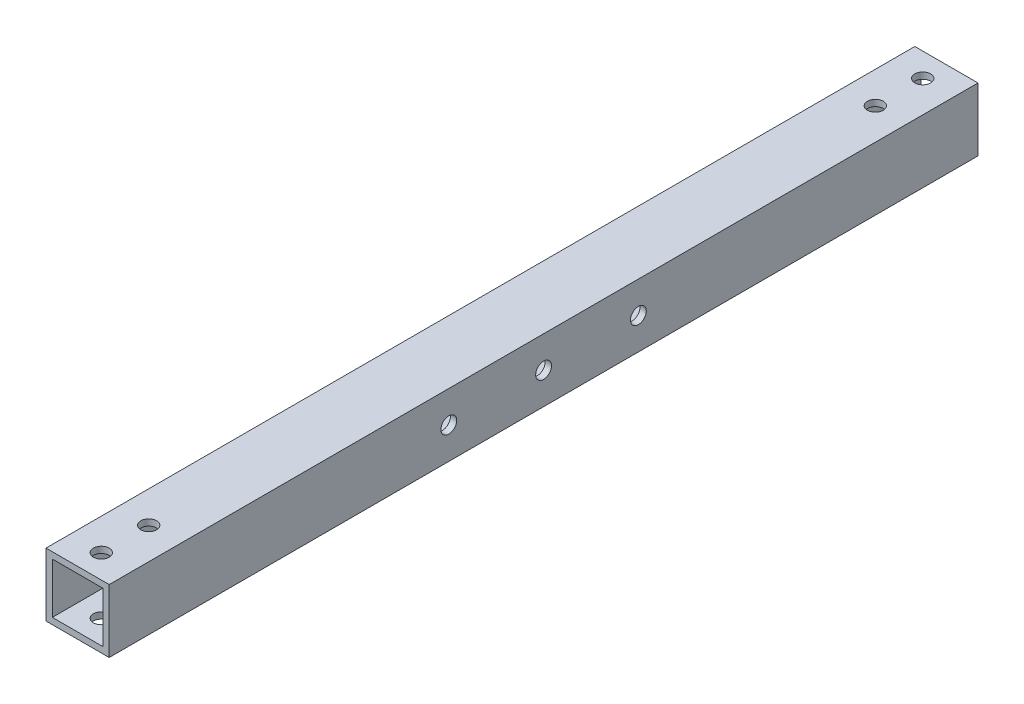
ISO-10303-21;
HEADER;
FILE_DESCRIPTION(('STEP AP214'),'2;1');
FILE_NAME('part.step','',(''),(''),'','','');
FILE_SCHEMA(('AUTOMOTIVE_DESIGN { 1 0 10303 214 1 1 1 1 }'));
ENDSEC;
DATA;
#1=APPLICATION_CONTEXT('core data for automotive mechanical design processes');
#2=APPLICATION_PROTOCOL_DEFINITION('international standard','automotive_design',2000,#1);
#3=PRODUCT_CONTEXT('',#1,'mechanical');
#4=PRODUCT('Part','Part','',(#3));
#5=PRODUCT_RELATED_PRODUCT_CATEGORY('part','',(#4));
#6=PRODUCT_DEFINITION_FORMATION('','',#4);
#7=PRODUCT_DEFINITION_CONTEXT('part definition',#1,'design');
#8=PRODUCT_DEFINITION('design','',#6,#7);
#9=PRODUCT_DEFINITION_SHAPE('','',#8);
#10=(LENGTH_UNIT() NAMED_UNIT(*) SI_UNIT(.MILLI.,.METRE.));
#11=(NAMED_UNIT(*) PLANE_ANGLE_UNIT() SI_UNIT($,.RADIAN.));
#12=(NAMED_UNIT(*) SI_UNIT($,.STERADIAN.) SOLID_ANGLE_UNIT());
#13=UNCERTAINTY_MEASURE_WITH_UNIT(LENGTH_MEASURE(1.E-05),#10,'distance_accuracy_value','');
#14=(GEOMETRIC_REPRESENTATION_CONTEXT(3) GLOBAL_UNCERTAINTY_ASSIGNED_CONTEXT((#13)) GLOBAL_UNIT_ASSIGNED_CONTEXT((#10,
#11,#12)) REPRESENTATION_CONTEXT('',''));
#15=CARTESIAN_POINT('',(0.,0.,0.));
#16=DIRECTION('',(0.,0.,1.));
#17=DIRECTION('',(1.,0.,0.));
#18=AXIS2_PLACEMENT_3D('',#15,#16,#17);
#19=CARTESIAN_POINT('',(0.,0.,275.));
#20=DIRECTION('',(0.,0.,1.));
#21=DIRECTION('',(1.,0.,0.));
#22=AXIS2_PLACEMENT_3D('',#19,#20,#21);
#23=PLANE('',#22);
#24=DIRECTION('',(0.,1.,0.));
#25=VECTOR('',#24,1.);
#26=CARTESIAN_POINT('',(10.,10.,275.));
#27=LINE('',#26,#25);
#28=CARTESIAN_POINT('',(10.,-10.,275.));
#29=VERTEX_POINT('',#28);
#30=CARTESIAN_POINT('',(10.,10.,275.));
#31=VERTEX_POINT('',#30);
#32=EDGE_CURVE('E138',#29,#31,#27,.T.);
#33=ORIENTED_EDGE('',*,*,#32,.T.);
#34=DIRECTION('',(-1.,0.,0.));
#35=VECTOR('',#34,1.);
#36=CARTESIAN_POINT('',(-10.,10.,275.));
#37=LINE('',#36,#35);
#38=CARTESIAN_POINT('',(-10.,10.,275.));
#39=VERTEX_POINT('',#38);
#40=EDGE_CURVE('E141',#31,#39,#37,.T.);
#41=ORIENTED_EDGE('',*,*,#40,.T.);
#42=DIRECTION('',(0.,-1.,0.));
#43=VECTOR('',#42,1.);
#44=CARTESIAN_POINT('',(-10.,10.,275.));
#45=LINE('',#44,#43);
#46=CARTESIAN_POINT('',(-9.99999999999999,-10.,275.));
#47=VERTEX_POINT('',#46);
#48=EDGE_CURVE('E144',#39,#47,#45,.T.);
#49=ORIENTED_EDGE('',*,*,#48,.T.);
#50=DIRECTION('',(1.,0.,0.));
#51=VECTOR('',#50,1.);
#52=CARTESIAN_POINT('',(-9.99999999999999,-10.,275.));
#53=LINE('',#52,#51);
#54=EDGE_CURVE('E146',#47,#29,#53,.T.);
#55=ORIENTED_EDGE('',*,*,#54,.T.);
#56=EDGE_LOOP('',(#33,#41,#49,#55));
#57=FACE_BOUND('',#56,.T.);
#58=DIRECTION('',(-1.,0.,0.));
#59=VECTOR('',#58,1.);
#60=CARTESIAN_POINT('',(-8.00000000000001,8.,275.));
#61=LINE('',#60,#59);
#62=CARTESIAN_POINT('',(8.,8.,275.));
#63=VERTEX_POINT('',#62);
#64=CARTESIAN_POINT('',(-8.00000000000001,8.,275.));
#65=VERTEX_POINT('',#64);
#66=EDGE_CURVE('E108',#63,#65,#61,.T.);
#67=ORIENTED_EDGE('',*,*,#66,.F.);
#68=DIRECTION('',(0.,1.,0.));
#69=VECTOR('',#68,1.);
#70=CARTESIAN_POINT('',(8.,8.,275.));
#71=LINE('',#70,#69);
#72=CARTESIAN_POINT('',(8.00000000000001,-8.,275.));
#73=VERTEX_POINT('',#72);
#74=EDGE_CURVE('E100',#73,#63,#71,.T.);
#75=ORIENTED_EDGE('',*,*,#74,.F.);
#76=DIRECTION('',(1.,0.,0.));
#77=VECTOR('',#76,1.);
#78=CARTESIAN_POINT('',(-8.,-8.00000000000001,275.));
#79=LINE('',#78,#77);
#80=CARTESIAN_POINT('',(-8.,-8.00000000000001,275.));
#81=VERTEX_POINT('',#80);
#82=EDGE_CURVE('E122',#81,#73,#79,.T.);
#83=ORIENTED_EDGE('',*,*,#82,.F.);
#84=DIRECTION('',(0.,-1.,0.));
#85=VECTOR('',#84,1.);
#86=CARTESIAN_POINT('',(-8.00000000000001,8.,275.));
#87=LINE('',#86,#85);
#88=EDGE_CURVE('E120',#65,#81,#87,.T.);
#89=ORIENTED_EDGE('',*,*,#88,.F.);
#90=EDGE_LOOP('',(#67,#75,#83,#89));
#91=FACE_BOUND('',#90,.T.);
#92=ADVANCED_FACE('F33',(#57,#91),#23,.T.);
#93=CARTESIAN_POINT('',(0.,0.,0.));
#94=DIRECTION('',(0.,0.,1.));
#95=DIRECTION('',(1.,0.,0.));
#96=AXIS2_PLACEMENT_3D('',#93,#94,#95);
#97=PLANE('',#96);
#98=DIRECTION('',(0.,1.,0.));
#99=VECTOR('',#98,1.);
#100=CARTESIAN_POINT('',(10.,10.,0.));
#101=LINE('',#100,#99);
#102=CARTESIAN_POINT('',(10.,-10.,0.));
#103=VERTEX_POINT('',#102);
#104=CARTESIAN_POINT('',(10.,10.,0.));
#105=VERTEX_POINT('',#104);
#106=EDGE_CURVE('E116',#103,#105,#101,.T.);
#107=ORIENTED_EDGE('',*,*,#106,.F.);
#108=DIRECTION('',(1.,0.,0.));
#109=VECTOR('',#108,1.);
#110=CARTESIAN_POINT('',(-9.99999999999999,-10.,0.));
#111=LINE('',#110,#109);
#112=CARTESIAN_POINT('',(-9.99999999999999,-10.,0.));
#113=VERTEX_POINT('',#112);
#114=EDGE_CURVE('E142',#113,#103,#111,.T.);
#115=ORIENTED_EDGE('',*,*,#114,.F.);
#116=DIRECTION('',(0.,-1.,0.));
#117=VECTOR('',#116,1.);
#118=CARTESIAN_POINT('',(-10.,10.,0.));
#119=LINE('',#118,#117);
#120=CARTESIAN_POINT('',(-10.,10.,0.));
#121=VERTEX_POINT('',#120);
#122=EDGE_CURVE('E153',#121,#113,#119,.T.);
#123=ORIENTED_EDGE('',*,*,#122,.F.);
#124=DIRECTION('',(-1.,0.,0.));
#125=VECTOR('',#124,1.);
#126=CARTESIAN_POINT('',(-10.,10.,0.));
#127=LINE('',#126,#125);
#128=EDGE_CURVE('E151',#105,#121,#127,.T.);
#129=ORIENTED_EDGE('',*,*,#128,.F.);
#130=EDGE_LOOP('',(#107,#115,#123,#129));
#131=FACE_BOUND('',#130,.T.);
#132=DIRECTION('',(0.,1.,0.));
#133=VECTOR('',#132,1.);
#134=CARTESIAN_POINT('',(8.,8.,0.));
#135=LINE('',#134,#133);
#136=CARTESIAN_POINT('',(8.00000000000001,-8.,0.));
#137=VERTEX_POINT('',#136);
#138=CARTESIAN_POINT('',(8.,8.,0.));
#139=VERTEX_POINT('',#138);
#140=EDGE_CURVE('E58',#137,#139,#135,.T.);
#141=ORIENTED_EDGE('',*,*,#140,.T.);
#142=DIRECTION('',(-1.,0.,0.));
#143=VECTOR('',#142,1.);
#144=CARTESIAN_POINT('',(-8.00000000000001,8.,0.));
#145=LINE('',#144,#143);
#146=CARTESIAN_POINT('',(-8.00000000000001,8.,0.));
#147=VERTEX_POINT('',#146);
#148=EDGE_CURVE('E115',#139,#147,#145,.T.);
#149=ORIENTED_EDGE('',*,*,#148,.T.);
#150=DIRECTION('',(0.,-1.,0.));
#151=VECTOR('',#150,1.);
#152=CARTESIAN_POINT('',(-8.00000000000001,8.,0.));
#153=LINE('',#152,#151);
#154=CARTESIAN_POINT('',(-8.,-8.00000000000001,0.));
#155=VERTEX_POINT('',#154);
#156=EDGE_CURVE('E130',#147,#155,#153,.T.);
#157=ORIENTED_EDGE('',*,*,#156,.T.);
#158=DIRECTION('',(1.,0.,0.));
#159=VECTOR('',#158,1.);
#160=CARTESIAN_POINT('',(-8.,-8.00000000000001,0.));
#161=LINE('',#160,#159);
#162=EDGE_CURVE('E109',#155,#137,#161,.T.);
#163=ORIENTED_EDGE('',*,*,#162,.T.);
#164=EDGE_LOOP('',(#141,#149,#157,#163));
#165=FACE_BOUND('',#164,.T.);
#166=ADVANCED_FACE('F266',(#131,#165),#97,.F.);
#167=CARTESIAN_POINT('',(10.,10.,275.));
#168=DIRECTION('',(-1.,0.,0.));
#169=DIRECTION('',(0.,0.,1.));
#170=AXIS2_PLACEMENT_3D('',#167,#168,#169);
#171=PLANE('',#170);
#172=CARTESIAN_POINT('',(10.,0.,167.5));
#173=DIRECTION('',(-1.,0.,0.));
#174=DIRECTION('',(0.,1.,0.));
#175=AXIS2_PLACEMENT_3D('',#172,#173,#174);
#176=CIRCLE('',#175,2.5);
#177=CARTESIAN_POINT('',(10.,2.5,167.5));
#178=VERTEX_POINT('',#177);
#179=EDGE_CURVE('E187',#178,#178,#176,.T.);
#180=ORIENTED_EDGE('',*,*,#179,.T.);
#181=EDGE_LOOP('',(#180));
#182=FACE_BOUND('',#181,.T.);
#183=CARTESIAN_POINT('',(10.,0.,137.5));
#184=DIRECTION('',(-1.,0.,0.));
#185=DIRECTION('',(0.,-1.,0.));
#186=AXIS2_PLACEMENT_3D('',#183,#184,#185);
#187=CIRCLE('',#186,2.5);
#188=CARTESIAN_POINT('',(10.,-2.5,137.5));
#189=VERTEX_POINT('',#188);
#190=EDGE_CURVE('E198',#189,#189,#187,.T.);
#191=ORIENTED_EDGE('',*,*,#190,.T.);
#192=EDGE_LOOP('',(#191));
#193=FACE_BOUND('',#192,.T.);
#194=CARTESIAN_POINT('',(10.,0.,107.5));
#195=DIRECTION('',(-1.,0.,0.));
#196=DIRECTION('',(0.,-1.,0.));
#197=AXIS2_PLACEMENT_3D('',#194,#195,#196);
#198=CIRCLE('',#197,2.5);
#199=CARTESIAN_POINT('',(10.,-2.5,107.5));
#200=VERTEX_POINT('',#199);
#201=EDGE_CURVE('E183',#200,#200,#198,.T.);
#202=ORIENTED_EDGE('',*,*,#201,.T.);
#203=EDGE_LOOP('',(#202));
#204=FACE_BOUND('',#203,.T.);
#205=ORIENTED_EDGE('',*,*,#106,.T.);
#206=DIRECTION('',(0.,0.,-1.));
#207=VECTOR('',#206,1.);
#208=CARTESIAN_POINT('',(10.,10.,275.));
#209=LINE('',#208,#207);
#210=EDGE_CURVE('E11',#31,#105,#209,.T.);
#211=ORIENTED_EDGE('',*,*,#210,.F.);
#212=ORIENTED_EDGE('',*,*,#32,.F.);
#213=DIRECTION('',(0.,0.,-1.));
#214=VECTOR('',#213,1.);
#215=CARTESIAN_POINT('',(10.,-10.,275.));
#216=LINE('',#215,#214);
#217=EDGE_CURVE('E148',#29,#103,#216,.T.);
#218=ORIENTED_EDGE('',*,*,#217,.T.);
#219=EDGE_LOOP('',(#205,#211,#212,#218));
#220=FACE_BOUND('',#219,.T.);
#221=ADVANCED_FACE('F35',(#182,#193,#204,#220),#171,.F.);
#222=CARTESIAN_POINT('',(-10.,10.,275.));
#223=DIRECTION('',(0.,-1.,0.));
#224=DIRECTION('',(0.,0.,-1.));
#225=AXIS2_PLACEMENT_3D('',#222,#223,#224);
#226=PLANE('',#225);
#227=CARTESIAN_POINT('',(0.,10.,267.5));
#228=DIRECTION('',(0.,-1.,0.));
#229=DIRECTION('',(0.,0.,1.));
#230=AXIS2_PLACEMENT_3D('',#227,#228,#229);
#231=CIRCLE('',#230,2.5);
#232=CARTESIAN_POINT('',(0.,10.,270.));
#233=VERTEX_POINT('',#232);
#234=EDGE_CURVE('E171',#233,#233,#231,.T.);
#235=ORIENTED_EDGE('',*,*,#234,.T.);
#236=EDGE_LOOP('',(#235));
#237=FACE_BOUND('',#236,.T.);
#238=CARTESIAN_POINT('',(0.,10.,252.5));
#239=DIRECTION('',(0.,-1.,0.));
#240=DIRECTION('',(0.,0.,-1.));
#241=AXIS2_PLACEMENT_3D('',#238,#239,#240);
#242=CIRCLE('',#241,2.5);
#243=CARTESIAN_POINT('',(0.,10.,250.));
#244=VERTEX_POINT('',#243);
#245=EDGE_CURVE('E222',#244,#244,#242,.T.);
#246=ORIENTED_EDGE('',*,*,#245,.T.);
#247=EDGE_LOOP('',(#246));
#248=FACE_BOUND('',#247,.T.);
#249=CARTESIAN_POINT('',(0.,10.,22.5));
#250=DIRECTION('',(0.,-1.,0.));
#251=DIRECTION('',(0.,0.,1.));
#252=AXIS2_PLACEMENT_3D('',#249,#250,#251);
#253=CIRCLE('',#252,2.5);
#254=CARTESIAN_POINT('',(0.,10.,25.));
#255=VERTEX_POINT('',#254);
#256=EDGE_CURVE('E228',#255,#255,#253,.T.);
#257=ORIENTED_EDGE('',*,*,#256,.T.);
#258=EDGE_LOOP('',(#257));
#259=FACE_BOUND('',#258,.T.);
#260=CARTESIAN_POINT('',(0.,10.,7.5));
#261=DIRECTION('',(0.,-1.,0.));
#262=DIRECTION('',(0.,0.,-1.));
#263=AXIS2_PLACEMENT_3D('',#260,#261,#262);
#264=CIRCLE('',#263,2.5);
#265=CARTESIAN_POINT('',(0.,10.,5.));
#266=VERTEX_POINT('',#265);
#267=EDGE_CURVE('E166',#266,#266,#264,.T.);
#268=ORIENTED_EDGE('',*,*,#267,.T.);
#269=EDGE_LOOP('',(#268));
#270=FACE_BOUND('',#269,.T.);
#271=ORIENTED_EDGE('',*,*,#128,.T.);
#272=DIRECTION('',(0.,0.,-1.));
#273=VECTOR('',#272,1.);
#274=CARTESIAN_POINT('',(-10.,10.,275.));
#275=LINE('',#274,#273);
#276=EDGE_CURVE('E42',#39,#121,#275,.T.);
#277=ORIENTED_EDGE('',*,*,#276,.F.);
#278=ORIENTED_EDGE('',*,*,#40,.F.);
#279=ORIENTED_EDGE('',*,*,#210,.T.);
#280=EDGE_LOOP('',(#271,#277,#278,#279));
#281=FACE_BOUND('',#280,.T.);
#282=ADVANCED_FACE('F280',(#237,#248,#259,#270,#281),#226,.F.);
#283=CARTESIAN_POINT('',(-10.,10.,275.));
#284=DIRECTION('',(1.,0.,0.));
#285=DIRECTION('',(0.,1.,0.));
#286=AXIS2_PLACEMENT_3D('',#283,#284,#285);
#287=PLANE('',#286);
#288=CARTESIAN_POINT('',(-10.,0.,167.5));
#289=DIRECTION('',(-1.,0.,0.));
#290=DIRECTION('',(0.,1.,0.));
#291=AXIS2_PLACEMENT_3D('',#288,#289,#290);
#292=CIRCLE('',#291,2.5);
#293=CARTESIAN_POINT('',(-10.,2.5,167.5));
#294=VERTEX_POINT('',#293);
#295=EDGE_CURVE('E193',#294,#294,#292,.T.);
#296=ORIENTED_EDGE('',*,*,#295,.F.);
#297=EDGE_LOOP('',(#296));
#298=FACE_BOUND('',#297,.T.);
#299=CARTESIAN_POINT('',(-10.,0.,137.5));
#300=DIRECTION('',(-1.,0.,0.));
#301=DIRECTION('',(0.,-1.,0.));
#302=AXIS2_PLACEMENT_3D('',#299,#300,#301);
#303=CIRCLE('',#302,2.5);
#304=CARTESIAN_POINT('',(-10.,-2.5,137.5));
#305=VERTEX_POINT('',#304);
#306=EDGE_CURVE('E203',#305,#305,#303,.T.);
#307=ORIENTED_EDGE('',*,*,#306,.F.);
#308=EDGE_LOOP('',(#307));
#309=FACE_BOUND('',#308,.T.);
#310=CARTESIAN_POINT('',(-10.,0.,107.5));
#311=DIRECTION('',(-1.,0.,0.));
#312=DIRECTION('',(0.,-1.,0.));
#313=AXIS2_PLACEMENT_3D('',#310,#311,#312);
#314=CIRCLE('',#313,2.5);
#315=CARTESIAN_POINT('',(-10.,-2.5,107.5));
#316=VERTEX_POINT('',#315);
#317=EDGE_CURVE('E209',#316,#316,#314,.T.);
#318=ORIENTED_EDGE('',*,*,#317,.F.);
#319=EDGE_LOOP('',(#318));
#320=FACE_BOUND('',#319,.T.);
#321=ORIENTED_EDGE('',*,*,#122,.T.);
#322=DIRECTION('',(0.,0.,-1.));
#323=VECTOR('',#322,1.);
#324=CARTESIAN_POINT('',(-9.99999999999999,-10.,275.));
#325=LINE('',#324,#323);
#326=EDGE_CURVE('E158',#47,#113,#325,.T.);
#327=ORIENTED_EDGE('',*,*,#326,.F.);
#328=ORIENTED_EDGE('',*,*,#48,.F.);
#329=ORIENTED_EDGE('',*,*,#276,.T.);
#330=EDGE_LOOP('',(#321,#327,#328,#329));
#331=FACE_BOUND('',#330,.T.);
#332=ADVANCED_FACE('F277',(#298,#309,#320,#331),#287,.F.);
#333=CARTESIAN_POINT('',(-9.99999999999999,-10.,275.));
#334=DIRECTION('',(0.,1.,0.));
#335=DIRECTION('',(0.,0.,1.));
#336=AXIS2_PLACEMENT_3D('',#333,#334,#335);
#337=PLANE('',#336);
#338=CARTESIAN_POINT('',(0.,-10.,267.5));
#339=DIRECTION('',(0.,-1.,0.));
#340=DIRECTION('',(0.,0.,1.));
#341=AXIS2_PLACEMENT_3D('',#338,#339,#340);
#342=CIRCLE('',#341,2.5);
#343=CARTESIAN_POINT('',(0.,-10.,270.));
#344=VERTEX_POINT('',#343);
#345=EDGE_CURVE('E219',#344,#344,#342,.T.);
#346=ORIENTED_EDGE('',*,*,#345,.F.);
#347=EDGE_LOOP('',(#346));
#348=FACE_BOUND('',#347,.T.);
#349=CARTESIAN_POINT('',(0.,-10.,252.5));
#350=DIRECTION('',(0.,-1.,0.));
#351=DIRECTION('',(0.,0.,-1.));
#352=AXIS2_PLACEMENT_3D('',#349,#350,#351);
#353=CIRCLE('',#352,2.5);
#354=CARTESIAN_POINT('',(0.,-10.,250.));
#355=VERTEX_POINT('',#354);
#356=EDGE_CURVE('E225',#355,#355,#353,.T.);
#357=ORIENTED_EDGE('',*,*,#356,.F.);
#358=EDGE_LOOP('',(#357));
#359=FACE_BOUND('',#358,.T.);
#360=CARTESIAN_POINT('',(0.,-10.,22.5));
#361=DIRECTION('',(0.,-1.,0.));
#362=DIRECTION('',(0.,0.,1.));
#363=AXIS2_PLACEMENT_3D('',#360,#361,#362);
#364=CIRCLE('',#363,2.5);
#365=CARTESIAN_POINT('',(0.,-10.,25.));
#366=VERTEX_POINT('',#365);
#367=EDGE_CURVE('E216',#366,#366,#364,.T.);
#368=ORIENTED_EDGE('',*,*,#367,.F.);
#369=EDGE_LOOP('',(#368));
#370=FACE_BOUND('',#369,.T.);
#371=CARTESIAN_POINT('',(0.,-10.,7.5));
#372=DIRECTION('',(0.,-1.,0.));
#373=DIRECTION('',(0.,0.,-1.));
#374=AXIS2_PLACEMENT_3D('',#371,#372,#373);
#375=CIRCLE('',#374,2.5);
#376=CARTESIAN_POINT('',(0.,-10.,5.));
#377=VERTEX_POINT('',#376);
#378=EDGE_CURVE('E239',#377,#377,#375,.T.);
#379=ORIENTED_EDGE('',*,*,#378,.F.);
#380=EDGE_LOOP('',(#379));
#381=FACE_BOUND('',#380,.T.);
#382=ORIENTED_EDGE('',*,*,#114,.T.);
#383=ORIENTED_EDGE('',*,*,#217,.F.);
#384=ORIENTED_EDGE('',*,*,#54,.F.);
#385=ORIENTED_EDGE('',*,*,#326,.T.);
#386=EDGE_LOOP('',(#382,#383,#384,#385));
#387=FACE_BOUND('',#386,.T.);
#388=ADVANCED_FACE('F260',(#348,#359,#370,#381,#387),#337,.F.);
#389=CARTESIAN_POINT('',(8.,8.,275.));
#390=DIRECTION('',(-1.,0.,0.));
#391=DIRECTION('',(0.,-1.,0.));
#392=AXIS2_PLACEMENT_3D('',#389,#390,#391);
#393=PLANE('',#392);
#394=CARTESIAN_POINT('',(8.,0.,167.5));
#395=DIRECTION('',(-1.,0.,0.));
#396=DIRECTION('',(0.,-1.,0.));
#397=AXIS2_PLACEMENT_3D('',#394,#395,#396);
#398=CIRCLE('',#397,2.5);
#399=CARTESIAN_POINT('',(8.,-2.49999999999999,167.5));
#400=VERTEX_POINT('',#399);
#401=EDGE_CURVE('E206',#400,#400,#398,.T.);
#402=ORIENTED_EDGE('',*,*,#401,.F.);
#403=EDGE_LOOP('',(#402));
#404=FACE_BOUND('',#403,.T.);
#405=CARTESIAN_POINT('',(8.,0.,137.5));
#406=DIRECTION('',(-1.,0.,0.));
#407=DIRECTION('',(0.,-1.,0.));
#408=AXIS2_PLACEMENT_3D('',#405,#406,#407);
#409=CIRCLE('',#408,2.5);
#410=CARTESIAN_POINT('',(8.,-2.5,137.5));
#411=VERTEX_POINT('',#410);
#412=EDGE_CURVE('E186',#411,#411,#409,.T.);
#413=ORIENTED_EDGE('',*,*,#412,.F.);
#414=EDGE_LOOP('',(#413));
#415=FACE_BOUND('',#414,.T.);
#416=CARTESIAN_POINT('',(8.,0.,107.5));
#417=DIRECTION('',(-1.,0.,0.));
#418=DIRECTION('',(0.,-1.,0.));
#419=AXIS2_PLACEMENT_3D('',#416,#417,#418);
#420=CIRCLE('',#419,2.5);
#421=CARTESIAN_POINT('',(8.,-2.5,107.5));
#422=VERTEX_POINT('',#421);
#423=EDGE_CURVE('E182',#422,#422,#420,.T.);
#424=ORIENTED_EDGE('',*,*,#423,.F.);
#425=EDGE_LOOP('',(#424));
#426=FACE_BOUND('',#425,.T.);
#427=ORIENTED_EDGE('',*,*,#140,.F.);
#428=DIRECTION('',(0.,0.,-1.));
#429=VECTOR('',#428,1.);
#430=CARTESIAN_POINT('',(8.00000000000001,-8.,275.));
#431=LINE('',#430,#429);
#432=EDGE_CURVE('E104',#73,#137,#431,.T.);
#433=ORIENTED_EDGE('',*,*,#432,.F.);
#434=ORIENTED_EDGE('',*,*,#74,.T.);
#435=DIRECTION('',(0.,0.,-1.));
#436=VECTOR('',#435,1.);
#437=CARTESIAN_POINT('',(8.,8.,275.));
#438=LINE('',#437,#436);
#439=EDGE_CURVE('E103',#63,#139,#438,.T.);
#440=ORIENTED_EDGE('',*,*,#439,.T.);
#441=EDGE_LOOP('',(#427,#433,#434,#440));
#442=FACE_BOUND('',#441,.T.);
#443=ADVANCED_FACE('F102',(#404,#415,#426,#442),#393,.T.);
#444=CARTESIAN_POINT('',(-8.00000000000001,8.,275.));
#445=DIRECTION('',(0.,-1.,0.));
#446=DIRECTION('',(1.,0.,0.));
#447=AXIS2_PLACEMENT_3D('',#444,#445,#446);
#448=PLANE('',#447);
#449=CARTESIAN_POINT('',(0.,8.,267.5));
#450=DIRECTION('',(0.,-1.,0.));
#451=DIRECTION('',(1.,0.,0.));
#452=AXIS2_PLACEMENT_3D('',#449,#450,#451);
#453=CIRCLE('',#452,2.5);
#454=CARTESIAN_POINT('',(2.50000000000001,8.,267.5));
#455=VERTEX_POINT('',#454);
#456=EDGE_CURVE('E179',#455,#455,#453,.T.);
#457=ORIENTED_EDGE('',*,*,#456,.F.);
#458=EDGE_LOOP('',(#457));
#459=FACE_BOUND('',#458,.T.);
#460=CARTESIAN_POINT('',(0.,8.,252.5));
#461=DIRECTION('',(0.,-1.,0.));
#462=DIRECTION('',(1.,0.,0.));
#463=AXIS2_PLACEMENT_3D('',#460,#461,#462);
#464=CIRCLE('',#463,2.5);
#465=CARTESIAN_POINT('',(2.50000000000001,8.,252.5));
#466=VERTEX_POINT('',#465);
#467=EDGE_CURVE('E175',#466,#466,#464,.T.);
#468=ORIENTED_EDGE('',*,*,#467,.F.);
#469=EDGE_LOOP('',(#468));
#470=FACE_BOUND('',#469,.T.);
#471=CARTESIAN_POINT('',(0.,8.,22.5));
#472=DIRECTION('',(0.,-1.,0.));
#473=DIRECTION('',(1.,0.,0.));
#474=AXIS2_PLACEMENT_3D('',#471,#472,#473);
#475=CIRCLE('',#474,2.5);
#476=CARTESIAN_POINT('',(2.5,8.,22.5));
#477=VERTEX_POINT('',#476);
#478=EDGE_CURVE('E170',#477,#477,#475,.T.);
#479=ORIENTED_EDGE('',*,*,#478,.F.);
#480=EDGE_LOOP('',(#479));
#481=FACE_BOUND('',#480,.T.);
#482=CARTESIAN_POINT('',(0.,8.,7.5));
#483=DIRECTION('',(0.,-1.,0.));
#484=DIRECTION('',(1.,0.,0.));
#485=AXIS2_PLACEMENT_3D('',#482,#483,#484);
#486=CIRCLE('',#485,2.5);
#487=CARTESIAN_POINT('',(2.50000000000001,8.,7.5));
#488=VERTEX_POINT('',#487);
#489=EDGE_CURVE('E128',#488,#488,#486,.T.);
#490=ORIENTED_EDGE('',*,*,#489,.F.);
#491=EDGE_LOOP('',(#490));
#492=FACE_BOUND('',#491,.T.);
#493=ORIENTED_EDGE('',*,*,#148,.F.);
#494=ORIENTED_EDGE('',*,*,#439,.F.);
#495=ORIENTED_EDGE('',*,*,#66,.T.);
#496=DIRECTION('',(0.,0.,-1.));
#497=VECTOR('',#496,1.);
#498=CARTESIAN_POINT('',(-8.00000000000001,8.,275.));
#499=LINE('',#498,#497);
#500=EDGE_CURVE('E117',#65,#147,#499,.T.);
#501=ORIENTED_EDGE('',*,*,#500,.T.);
#502=EDGE_LOOP('',(#493,#494,#495,#501));
#503=FACE_BOUND('',#502,.T.);
#504=ADVANCED_FACE('F112',(#459,#470,#481,#492,#503),#448,.T.);
#505=CARTESIAN_POINT('',(-8.00000000000001,8.,275.));
#506=DIRECTION('',(1.,0.,0.));
#507=DIRECTION('',(0.,1.,0.));
#508=AXIS2_PLACEMENT_3D('',#505,#506,#507);
#509=PLANE('',#508);
#510=CARTESIAN_POINT('',(-8.00000000000001,0.,167.5));
#511=DIRECTION('',(1.,0.,0.));
#512=DIRECTION('',(0.,1.,0.));
#513=AXIS2_PLACEMENT_3D('',#510,#511,#512);
#514=CIRCLE('',#513,2.5);
#515=CARTESIAN_POINT('',(-8.00000000000001,2.5,167.5));
#516=VERTEX_POINT('',#515);
#517=EDGE_CURVE('E37',#516,#516,#514,.T.);
#518=ORIENTED_EDGE('',*,*,#517,.F.);
#519=EDGE_LOOP('',(#518));
#520=FACE_BOUND('',#519,.T.);
#521=CARTESIAN_POINT('',(-8.00000000000001,0.,137.5));
#522=DIRECTION('',(1.,0.,0.));
#523=DIRECTION('',(0.,1.,0.));
#524=AXIS2_PLACEMENT_3D('',#521,#522,#523);
#525=CIRCLE('',#524,2.5);
#526=CARTESIAN_POINT('',(-8.00000000000001,2.49999999999999,137.5));
#527=VERTEX_POINT('',#526);
#528=EDGE_CURVE('E184',#527,#527,#525,.T.);
#529=ORIENTED_EDGE('',*,*,#528,.F.);
#530=EDGE_LOOP('',(#529));
#531=FACE_BOUND('',#530,.T.);
#532=CARTESIAN_POINT('',(-8.00000000000001,0.,107.5));
#533=DIRECTION('',(1.,0.,0.));
#534=DIRECTION('',(0.,1.,0.));
#535=AXIS2_PLACEMENT_3D('',#532,#533,#534);
#536=CIRCLE('',#535,2.5);
#537=CARTESIAN_POINT('',(-8.00000000000001,2.49999999999999,107.5));
#538=VERTEX_POINT('',#537);
#539=EDGE_CURVE('E180',#538,#538,#536,.T.);
#540=ORIENTED_EDGE('',*,*,#539,.F.);
#541=EDGE_LOOP('',(#540));
#542=FACE_BOUND('',#541,.T.);
#543=ORIENTED_EDGE('',*,*,#156,.F.);
#544=ORIENTED_EDGE('',*,*,#500,.F.);
#545=ORIENTED_EDGE('',*,*,#88,.T.);
#546=DIRECTION('',(0.,0.,-1.));
#547=VECTOR('',#546,1.);
#548=CARTESIAN_POINT('',(-8.,-8.00000000000001,275.));
#549=LINE('',#548,#547);
#550=EDGE_CURVE('E50',#81,#155,#549,.T.);
#551=ORIENTED_EDGE('',*,*,#550,.T.);
#552=EDGE_LOOP('',(#543,#544,#545,#551));
#553=FACE_BOUND('',#552,.T.);
#554=ADVANCED_FACE('F250',(#520,#531,#542,#553),#509,.T.);
#555=CARTESIAN_POINT('',(-8.,-8.00000000000001,275.));
#556=DIRECTION('',(0.,1.,0.));
#557=DIRECTION('',(-1.,0.,0.));
#558=AXIS2_PLACEMENT_3D('',#555,#556,#557);
#559=PLANE('',#558);
#560=CARTESIAN_POINT('',(0.,-8.,267.5));
#561=DIRECTION('',(0.,1.,0.));
#562=DIRECTION('',(-1.,0.,0.));
#563=AXIS2_PLACEMENT_3D('',#560,#561,#562);
#564=CIRCLE('',#563,2.5);
#565=CARTESIAN_POINT('',(-2.5,-8.00000000000001,267.5));
#566=VERTEX_POINT('',#565);
#567=EDGE_CURVE('E176',#566,#566,#564,.T.);
#568=ORIENTED_EDGE('',*,*,#567,.F.);
#569=EDGE_LOOP('',(#568));
#570=FACE_BOUND('',#569,.T.);
#571=CARTESIAN_POINT('',(0.,-8.,252.5));
#572=DIRECTION('',(0.,1.,0.));
#573=DIRECTION('',(-1.,0.,0.));
#574=AXIS2_PLACEMENT_3D('',#571,#572,#573);
#575=CIRCLE('',#574,2.5);
#576=CARTESIAN_POINT('',(-2.5,-8.00000000000001,252.5));
#577=VERTEX_POINT('',#576);
#578=EDGE_CURVE('E172',#577,#577,#575,.T.);
#579=ORIENTED_EDGE('',*,*,#578,.F.);
#580=EDGE_LOOP('',(#579));
#581=FACE_BOUND('',#580,.T.);
#582=CARTESIAN_POINT('',(0.,-8.,22.5));
#583=DIRECTION('',(0.,1.,0.));
#584=DIRECTION('',(-1.,0.,0.));
#585=AXIS2_PLACEMENT_3D('',#582,#583,#584);
#586=CIRCLE('',#585,2.5);
#587=CARTESIAN_POINT('',(-2.5,-8.00000000000001,22.5));
#588=VERTEX_POINT('',#587);
#589=EDGE_CURVE('E167',#588,#588,#586,.T.);
#590=ORIENTED_EDGE('',*,*,#589,.F.);
#591=EDGE_LOOP('',(#590));
#592=FACE_BOUND('',#591,.T.);
#593=CARTESIAN_POINT('',(0.,-8.,7.5));
#594=DIRECTION('',(0.,1.,0.));
#595=DIRECTION('',(-1.,0.,0.));
#596=AXIS2_PLACEMENT_3D('',#593,#594,#595);
#597=CIRCLE('',#596,2.5);
#598=CARTESIAN_POINT('',(-2.5,-8.00000000000001,7.5));
#599=VERTEX_POINT('',#598);
#600=EDGE_CURVE('E163',#599,#599,#597,.T.);
#601=ORIENTED_EDGE('',*,*,#600,.F.);
#602=EDGE_LOOP('',(#601));
#603=FACE_BOUND('',#602,.T.);
#604=ORIENTED_EDGE('',*,*,#162,.F.);
#605=ORIENTED_EDGE('',*,*,#550,.F.);
#606=ORIENTED_EDGE('',*,*,#82,.T.);
#607=ORIENTED_EDGE('',*,*,#432,.T.);
#608=EDGE_LOOP('',(#604,#605,#606,#607));
#609=FACE_BOUND('',#608,.T.);
#610=ADVANCED_FACE('F257',(#570,#581,#592,#603,#609),#559,.T.);
#611=CARTESIAN_POINT('',(0.,10.,7.5));
#612=DIRECTION('',(0.,-1.,0.));
#613=DIRECTION('',(0.,0.,-1.));
#614=AXIS2_PLACEMENT_3D('',#611,#612,#613);
#615=CYLINDRICAL_SURFACE('',#614,2.5);
#616=ORIENTED_EDGE('',*,*,#600,.T.);
#617=EDGE_LOOP('',(#616));
#618=FACE_BOUND('',#617,.T.);
#619=ORIENTED_EDGE('',*,*,#378,.T.);
#620=EDGE_LOOP('',(#619));
#621=FACE_BOUND('',#620,.T.);
#622=ADVANCED_FACE('F311',(#618,#621),#615,.F.);
#623=ORIENTED_EDGE('',*,*,#489,.T.);
#624=EDGE_LOOP('',(#623));
#625=FACE_BOUND('',#624,.T.);
#626=ORIENTED_EDGE('',*,*,#267,.F.);
#627=EDGE_LOOP('',(#626));
#628=FACE_BOUND('',#627,.T.);
#629=ADVANCED_FACE('F246',(#625,#628),#615,.F.);
#630=CARTESIAN_POINT('',(0.,10.,22.5));
#631=DIRECTION('',(0.,-1.,0.));
#632=DIRECTION('',(0.,0.,-1.));
#633=AXIS2_PLACEMENT_3D('',#630,#631,#632);
#634=CYLINDRICAL_SURFACE('',#633,2.5);
#635=ORIENTED_EDGE('',*,*,#589,.T.);
#636=EDGE_LOOP('',(#635));
#637=FACE_BOUND('',#636,.T.);
#638=ORIENTED_EDGE('',*,*,#367,.T.);
#639=EDGE_LOOP('',(#638));
#640=FACE_BOUND('',#639,.T.);
#641=ADVANCED_FACE('F322',(#637,#640),#634,.F.);
#642=CARTESIAN_POINT('',(0.,10.,252.5));
#643=DIRECTION('',(0.,-1.,0.));
#644=DIRECTION('',(0.,0.,-1.));
#645=AXIS2_PLACEMENT_3D('',#642,#643,#644);
#646=CYLINDRICAL_SURFACE('',#645,2.5);
#647=ORIENTED_EDGE('',*,*,#578,.T.);
#648=EDGE_LOOP('',(#647));
#649=FACE_BOUND('',#648,.T.);
#650=ORIENTED_EDGE('',*,*,#356,.T.);
#651=EDGE_LOOP('',(#650));
#652=FACE_BOUND('',#651,.T.);
#653=ADVANCED_FACE('F325',(#649,#652),#646,.F.);
#654=CARTESIAN_POINT('',(0.,10.,267.5));
#655=DIRECTION('',(0.,-1.,0.));
#656=DIRECTION('',(0.,0.,-1.));
#657=AXIS2_PLACEMENT_3D('',#654,#655,#656);
#658=CYLINDRICAL_SURFACE('',#657,2.5);
#659=ORIENTED_EDGE('',*,*,#567,.T.);
#660=EDGE_LOOP('',(#659));
#661=FACE_BOUND('',#660,.T.);
#662=ORIENTED_EDGE('',*,*,#345,.T.);
#663=EDGE_LOOP('',(#662));
#664=FACE_BOUND('',#663,.T.);
#665=ADVANCED_FACE('F330',(#661,#664),#658,.F.);
#666=ORIENTED_EDGE('',*,*,#478,.T.);
#667=EDGE_LOOP('',(#666));
#668=FACE_BOUND('',#667,.T.);
#669=ORIENTED_EDGE('',*,*,#256,.F.);
#670=EDGE_LOOP('',(#669));
#671=FACE_BOUND('',#670,.T.);
#672=ADVANCED_FACE('F327',(#668,#671),#634,.F.);
#673=ORIENTED_EDGE('',*,*,#467,.T.);
#674=EDGE_LOOP('',(#673));
#675=FACE_BOUND('',#674,.T.);
#676=ORIENTED_EDGE('',*,*,#245,.F.);
#677=EDGE_LOOP('',(#676));
#678=FACE_BOUND('',#677,.T.);
#679=ADVANCED_FACE('F332',(#675,#678),#646,.F.);
#680=ORIENTED_EDGE('',*,*,#456,.T.);
#681=EDGE_LOOP('',(#680));
#682=FACE_BOUND('',#681,.T.);
#683=ORIENTED_EDGE('',*,*,#234,.F.);
#684=EDGE_LOOP('',(#683));
#685=FACE_BOUND('',#684,.T.);
#686=ADVANCED_FACE('F336',(#682,#685),#658,.F.);
#687=CARTESIAN_POINT('',(10.,0.,107.5));
#688=DIRECTION('',(-1.,0.,0.));
#689=DIRECTION('',(0.,-1.,0.));
#690=AXIS2_PLACEMENT_3D('',#687,#688,#689);
#691=CYLINDRICAL_SURFACE('',#690,2.5);
#692=ORIENTED_EDGE('',*,*,#539,.T.);
#693=EDGE_LOOP('',(#692));
#694=FACE_BOUND('',#693,.T.);
#695=ORIENTED_EDGE('',*,*,#317,.T.);
#696=EDGE_LOOP('',(#695));
#697=FACE_BOUND('',#696,.T.);
#698=ADVANCED_FACE('F337',(#694,#697),#691,.F.);
#699=ORIENTED_EDGE('',*,*,#423,.T.);
#700=EDGE_LOOP('',(#699));
#701=FACE_BOUND('',#700,.T.);
#702=ORIENTED_EDGE('',*,*,#201,.F.);
#703=EDGE_LOOP('',(#702));
#704=FACE_BOUND('',#703,.T.);
#705=ADVANCED_FACE('F340',(#701,#704),#691,.F.);
#706=CARTESIAN_POINT('',(10.,0.,137.5));
#707=DIRECTION('',(-1.,0.,0.));
#708=DIRECTION('',(0.,-1.,0.));
#709=AXIS2_PLACEMENT_3D('',#706,#707,#708);
#710=CYLINDRICAL_SURFACE('',#709,2.5);
#711=ORIENTED_EDGE('',*,*,#528,.T.);
#712=EDGE_LOOP('',(#711));
#713=FACE_BOUND('',#712,.T.);
#714=ORIENTED_EDGE('',*,*,#306,.T.);
#715=EDGE_LOOP('',(#714));
#716=FACE_BOUND('',#715,.T.);
#717=ADVANCED_FACE('F342',(#713,#716),#710,.F.);
#718=CARTESIAN_POINT('',(10.,0.,167.5));
#719=DIRECTION('',(-1.,0.,0.));
#720=DIRECTION('',(0.,-1.,0.));
#721=AXIS2_PLACEMENT_3D('',#718,#719,#720);
#722=CYLINDRICAL_SURFACE('',#721,2.5);
#723=ORIENTED_EDGE('',*,*,#517,.T.);
#724=EDGE_LOOP('',(#723));
#725=FACE_BOUND('',#724,.T.);
#726=ORIENTED_EDGE('',*,*,#295,.T.);
#727=EDGE_LOOP('',(#726));
#728=FACE_BOUND('',#727,.T.);
#729=ADVANCED_FACE('F345',(#725,#728),#722,.F.);
#730=ORIENTED_EDGE('',*,*,#412,.T.);
#731=EDGE_LOOP('',(#730));
#732=FACE_BOUND('',#731,.T.);
#733=ORIENTED_EDGE('',*,*,#190,.F.);
#734=EDGE_LOOP('',(#733));
#735=FACE_BOUND('',#734,.T.);
#736=ADVANCED_FACE('F346',(#732,#735),#710,.F.);
#737=ORIENTED_EDGE('',*,*,#401,.T.);
#738=EDGE_LOOP('',(#737));
#739=FACE_BOUND('',#738,.T.);
#740=ORIENTED_EDGE('',*,*,#179,.F.);
#741=EDGE_LOOP('',(#740));
#742=FACE_BOUND('',#741,.T.);
#743=ADVANCED_FACE('F349',(#739,#742),#722,.F.);
#744=CLOSED_SHELL('',(#92,#166,#221,#282,#332,#388,#443,#504,#554,#610,#622,#629,#641,#653,#665,
#672,#679,#686,#698,#705,#717,#729,#736,#743));
#745=MANIFOLD_SOLID_BREP('B2',#744);
#746=ADVANCED_BREP_SHAPE_REPRESENTATION('',(#18,#745),#14);
#747=SHAPE_DEFINITION_REPRESENTATION(#9,#746);
ENDSEC;
END-ISO-10303-21;
